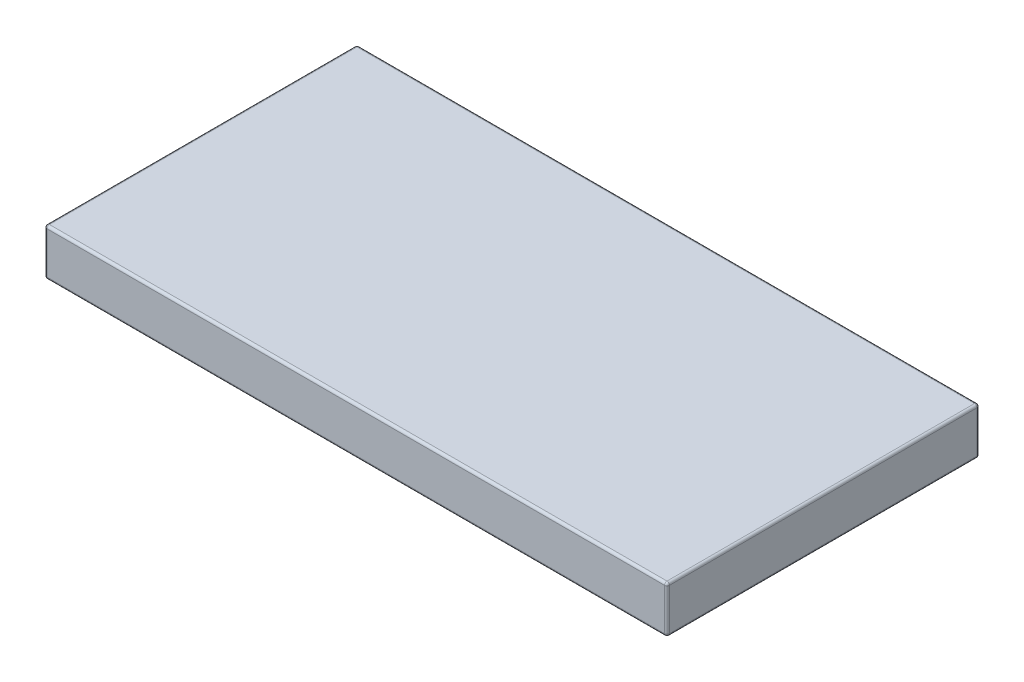
ISO-10303-21;
HEADER;
FILE_DESCRIPTION(('STEP AP214'),'2;1');
FILE_NAME('part.step','',(''),(''),'','','');
FILE_SCHEMA(('AUTOMOTIVE_DESIGN { 1 0 10303 214 1 1 1 1 }'));
ENDSEC;
DATA;
#1=APPLICATION_CONTEXT('core data for automotive mechanical design processes');
#2=APPLICATION_PROTOCOL_DEFINITION('international standard','automotive_design',2000,#1);
#3=PRODUCT_CONTEXT('',#1,'mechanical');
#4=PRODUCT('Part','Part','',(#3));
#5=PRODUCT_RELATED_PRODUCT_CATEGORY('part','',(#4));
#6=PRODUCT_DEFINITION_FORMATION('','',#4);
#7=PRODUCT_DEFINITION_CONTEXT('part definition',#1,'design');
#8=PRODUCT_DEFINITION('design','',#6,#7);
#9=PRODUCT_DEFINITION_SHAPE('','',#8);
#10=(LENGTH_UNIT() NAMED_UNIT(*) SI_UNIT(.MILLI.,.METRE.));
#11=(NAMED_UNIT(*) PLANE_ANGLE_UNIT() SI_UNIT($,.RADIAN.));
#12=(NAMED_UNIT(*) SI_UNIT($,.STERADIAN.) SOLID_ANGLE_UNIT());
#13=UNCERTAINTY_MEASURE_WITH_UNIT(LENGTH_MEASURE(1.E-05),#10,'distance_accuracy_value','');
#14=(GEOMETRIC_REPRESENTATION_CONTEXT(3) GLOBAL_UNCERTAINTY_ASSIGNED_CONTEXT((#13)) GLOBAL_UNIT_ASSIGNED_CONTEXT((#10,
#11,#12)) REPRESENTATION_CONTEXT('',''));
#15=CARTESIAN_POINT('',(0.,0.,0.));
#16=DIRECTION('',(0.,0.,1.));
#17=DIRECTION('',(1.,0.,0.));
#18=AXIS2_PLACEMENT_3D('',#15,#16,#17);
#19=CARTESIAN_POINT('',(-44.6911278195489,19.,-108.632180451128));
#20=DIRECTION('',(1.,0.,0.));
#21=DIRECTION('',(0.,0.,-1.));
#22=AXIS2_PLACEMENT_3D('',#19,#20,#21);
#23=PLANE('',#22);
#24=DIRECTION('',(0.,-1.,0.));
#25=VECTOR('',#24,1.);
#26=CARTESIAN_POINT('',(-44.6911278195489,19.,-107.632180451128));
#27=LINE('',#26,#25);
#28=CARTESIAN_POINT('',(-44.6911278195489,18.,-107.632180451128));
#29=VERTEX_POINT('',#28);
#30=CARTESIAN_POINT('',(-44.6911278195489,1.,-107.632180451128));
#31=VERTEX_POINT('',#30);
#32=EDGE_CURVE('E140',#29,#31,#27,.T.);
#33=ORIENTED_EDGE('',*,*,#32,.T.);
#34=DIRECTION('',(0.,0.,1.));
#35=VECTOR('',#34,1.);
#36=CARTESIAN_POINT('',(-44.6911278195489,1.,-108.632180451128));
#37=LINE('',#36,#35);
#38=CARTESIAN_POINT('',(-44.6911278195489,1.,17.3678195488722));
#39=VERTEX_POINT('',#38);
#40=EDGE_CURVE('E197',#31,#39,#37,.T.);
#41=ORIENTED_EDGE('',*,*,#40,.T.);
#42=DIRECTION('',(0.,-1.,0.));
#43=VECTOR('',#42,1.);
#44=CARTESIAN_POINT('',(-44.6911278195489,19.,17.3678195488722));
#45=LINE('',#44,#43);
#46=CARTESIAN_POINT('',(-44.6911278195489,18.,17.3678195488722));
#47=VERTEX_POINT('',#46);
#48=EDGE_CURVE('E194',#39,#47,#45,.F.);
#49=ORIENTED_EDGE('',*,*,#48,.T.);
#50=DIRECTION('',(0.,0.,1.));
#51=VECTOR('',#50,1.);
#52=CARTESIAN_POINT('',(-44.6911278195489,18.,-108.632180451128));
#53=LINE('',#52,#51);
#54=EDGE_CURVE('E192',#47,#29,#53,.F.);
#55=ORIENTED_EDGE('',*,*,#54,.T.);
#56=EDGE_LOOP('',(#33,#41,#49,#55));
#57=FACE_BOUND('',#56,.T.);
#58=ADVANCED_FACE('F33',(#57),#23,.F.);
#59=CARTESIAN_POINT('',(-44.6911278195489,19.,18.3678195488722));
#60=DIRECTION('',(0.,0.,-1.));
#61=DIRECTION('',(-1.,0.,0.));
#62=AXIS2_PLACEMENT_3D('',#59,#60,#61);
#63=PLANE('',#62);
#64=DIRECTION('',(1.,0.,0.));
#65=VECTOR('',#64,1.);
#66=CARTESIAN_POINT('',(-44.6911278195489,1.,18.3678195488722));
#67=LINE('',#66,#65);
#68=CARTESIAN_POINT('',(-43.6911278195489,1.,18.3678195488722));
#69=VERTEX_POINT('',#68);
#70=CARTESIAN_POINT('',(207.308872180451,1.,18.3678195488722));
#71=VERTEX_POINT('',#70);
#72=EDGE_CURVE('E187',#69,#71,#67,.T.);
#73=ORIENTED_EDGE('',*,*,#72,.T.);
#74=DIRECTION('',(0.,-1.,0.));
#75=VECTOR('',#74,1.);
#76=CARTESIAN_POINT('',(207.308872180451,19.,18.3678195488722));
#77=LINE('',#76,#75);
#78=CARTESIAN_POINT('',(207.308872180451,18.,18.3678195488722));
#79=VERTEX_POINT('',#78);
#80=EDGE_CURVE('E189',#71,#79,#77,.F.);
#81=ORIENTED_EDGE('',*,*,#80,.T.);
#82=DIRECTION('',(1.,0.,0.));
#83=VECTOR('',#82,1.);
#84=CARTESIAN_POINT('',(-44.6911278195489,18.,18.3678195488722));
#85=LINE('',#84,#83);
#86=CARTESIAN_POINT('',(-43.6911278195489,18.,18.3678195488722));
#87=VERTEX_POINT('',#86);
#88=EDGE_CURVE('E183',#79,#87,#85,.F.);
#89=ORIENTED_EDGE('',*,*,#88,.T.);
#90=DIRECTION('',(0.,-1.,0.));
#91=VECTOR('',#90,1.);
#92=CARTESIAN_POINT('',(-43.6911278195489,19.,18.3678195488722));
#93=LINE('',#92,#91);
#94=EDGE_CURVE('E185',#87,#69,#93,.T.);
#95=ORIENTED_EDGE('',*,*,#94,.T.);
#96=EDGE_LOOP('',(#73,#81,#89,#95));
#97=FACE_BOUND('',#96,.T.);
#98=ADVANCED_FACE('F275',(#97),#63,.F.);
#99=CARTESIAN_POINT('',(208.308872180451,19.,-108.632180451128));
#100=DIRECTION('',(-1.,0.,0.));
#101=DIRECTION('',(0.,0.,1.));
#102=AXIS2_PLACEMENT_3D('',#99,#100,#101);
#103=PLANE('',#102);
#104=DIRECTION('',(0.,0.,-1.));
#105=VECTOR('',#104,1.);
#106=CARTESIAN_POINT('',(208.308872180451,1.,-108.632180451128));
#107=LINE('',#106,#105);
#108=CARTESIAN_POINT('',(208.308872180451,1.,17.3678195488722));
#109=VERTEX_POINT('',#108);
#110=CARTESIAN_POINT('',(208.308872180451,1.,-107.632180451128));
#111=VERTEX_POINT('',#110);
#112=EDGE_CURVE('E169',#109,#111,#107,.T.);
#113=ORIENTED_EDGE('',*,*,#112,.T.);
#114=DIRECTION('',(0.,-1.,0.));
#115=VECTOR('',#114,1.);
#116=CARTESIAN_POINT('',(208.308872180451,19.,-107.632180451128));
#117=LINE('',#116,#115);
#118=CARTESIAN_POINT('',(208.308872180451,18.,-107.632180451128));
#119=VERTEX_POINT('',#118);
#120=EDGE_CURVE('E171',#111,#119,#117,.F.);
#121=ORIENTED_EDGE('',*,*,#120,.T.);
#122=DIRECTION('',(0.,0.,-1.));
#123=VECTOR('',#122,1.);
#124=CARTESIAN_POINT('',(208.308872180451,18.,18.3678195488722));
#125=LINE('',#124,#123);
#126=CARTESIAN_POINT('',(208.308872180451,18.,17.3678195488722));
#127=VERTEX_POINT('',#126);
#128=EDGE_CURVE('E165',#119,#127,#125,.F.);
#129=ORIENTED_EDGE('',*,*,#128,.T.);
#130=DIRECTION('',(0.,-1.,0.));
#131=VECTOR('',#130,1.);
#132=CARTESIAN_POINT('',(208.308872180451,19.,17.3678195488722));
#133=LINE('',#132,#131);
#134=EDGE_CURVE('E167',#127,#109,#133,.T.);
#135=ORIENTED_EDGE('',*,*,#134,.T.);
#136=EDGE_LOOP('',(#113,#121,#129,#135));
#137=FACE_BOUND('',#136,.T.);
#138=ADVANCED_FACE('F301',(#137),#103,.F.);
#139=CARTESIAN_POINT('',(-44.6911278195489,19.,-108.632180451128));
#140=DIRECTION('',(0.,0.,1.));
#141=DIRECTION('',(1.,0.,0.));
#142=AXIS2_PLACEMENT_3D('',#139,#140,#141);
#143=PLANE('',#142);
#144=DIRECTION('',(-1.,0.,0.));
#145=VECTOR('',#144,1.);
#146=CARTESIAN_POINT('',(208.308872180451,18.,-108.632180451128));
#147=LINE('',#146,#145);
#148=CARTESIAN_POINT('',(-43.6911278195489,18.,-108.632180451128));
#149=VERTEX_POINT('',#148);
#150=CARTESIAN_POINT('',(207.308872180451,18.,-108.632180451128));
#151=VERTEX_POINT('',#150);
#152=EDGE_CURVE('E126',#149,#151,#147,.F.);
#153=ORIENTED_EDGE('',*,*,#152,.T.);
#154=DIRECTION('',(0.,-1.,0.));
#155=VECTOR('',#154,1.);
#156=CARTESIAN_POINT('',(207.308872180451,19.,-108.632180451128));
#157=LINE('',#156,#155);
#158=CARTESIAN_POINT('',(207.308872180451,1.,-108.632180451128));
#159=VERTEX_POINT('',#158);
#160=EDGE_CURVE('E163',#151,#159,#157,.T.);
#161=ORIENTED_EDGE('',*,*,#160,.T.);
#162=DIRECTION('',(-1.,0.,0.));
#163=VECTOR('',#162,1.);
#164=CARTESIAN_POINT('',(-44.6911278195489,1.,-108.632180451128));
#165=LINE('',#164,#163);
#166=CARTESIAN_POINT('',(-43.6911278195489,1.,-108.632180451128));
#167=VERTEX_POINT('',#166);
#168=EDGE_CURVE('E129',#159,#167,#165,.T.);
#169=ORIENTED_EDGE('',*,*,#168,.T.);
#170=DIRECTION('',(0.,-1.,0.));
#171=VECTOR('',#170,1.);
#172=CARTESIAN_POINT('',(-43.6911278195489,19.,-108.632180451128));
#173=LINE('',#172,#171);
#174=EDGE_CURVE('E121',#167,#149,#173,.F.);
#175=ORIENTED_EDGE('',*,*,#174,.T.);
#176=EDGE_LOOP('',(#153,#161,#169,#175));
#177=FACE_BOUND('',#176,.T.);
#178=ADVANCED_FACE('F123',(#177),#143,.F.);
#179=CARTESIAN_POINT('',(0.,19.,0.));
#180=DIRECTION('',(0.,1.,0.));
#181=DIRECTION('',(0.,0.,1.));
#182=AXIS2_PLACEMENT_3D('',#179,#180,#181);
#183=PLANE('',#182);
#184=DIRECTION('',(0.,0.,-1.));
#185=VECTOR('',#184,1.);
#186=CARTESIAN_POINT('',(207.308872180451,19.,-108.632180451128));
#187=LINE('',#186,#185);
#188=CARTESIAN_POINT('',(207.308872180451,19.,17.3678195488722));
#189=VERTEX_POINT('',#188);
#190=CARTESIAN_POINT('',(207.308872180451,19.,-107.632180451128));
#191=VERTEX_POINT('',#190);
#192=EDGE_CURVE('E42',#189,#191,#187,.T.);
#193=ORIENTED_EDGE('',*,*,#192,.T.);
#194=DIRECTION('',(-1.,0.,0.));
#195=VECTOR('',#194,1.);
#196=CARTESIAN_POINT('',(-44.6911278195489,19.,-107.632180451128));
#197=LINE('',#196,#195);
#198=CARTESIAN_POINT('',(-43.6911278195489,19.,-107.632180451128));
#199=VERTEX_POINT('',#198);
#200=EDGE_CURVE('E11',#191,#199,#197,.T.);
#201=ORIENTED_EDGE('',*,*,#200,.T.);
#202=DIRECTION('',(0.,0.,1.));
#203=VECTOR('',#202,1.);
#204=CARTESIAN_POINT('',(-43.6911278195489,19.,18.3678195488722));
#205=LINE('',#204,#203);
#206=CARTESIAN_POINT('',(-43.6911278195489,19.,17.3678195488722));
#207=VERTEX_POINT('',#206);
#208=EDGE_CURVE('E199',#199,#207,#205,.T.);
#209=ORIENTED_EDGE('',*,*,#208,.T.);
#210=DIRECTION('',(1.,0.,0.));
#211=VECTOR('',#210,1.);
#212=CARTESIAN_POINT('',(208.308872180451,19.,17.3678195488722));
#213=LINE('',#212,#211);
#214=EDGE_CURVE('E53',#207,#189,#213,.T.);
#215=ORIENTED_EDGE('',*,*,#214,.T.);
#216=EDGE_LOOP('',(#193,#201,#209,#215));
#217=FACE_BOUND('',#216,.T.);
#218=ADVANCED_FACE('F364',(#217),#183,.T.);
#219=CARTESIAN_POINT('',(0.,0.,0.));
#220=DIRECTION('',(0.,1.,0.));
#221=DIRECTION('',(0.,0.,1.));
#222=AXIS2_PLACEMENT_3D('',#219,#220,#221);
#223=PLANE('',#222);
#224=DIRECTION('',(-1.,0.,0.));
#225=VECTOR('',#224,1.);
#226=CARTESIAN_POINT('',(0.,0.,-107.632180451128));
#227=LINE('',#226,#225);
#228=CARTESIAN_POINT('',(-43.6911278195489,0.,-107.632180451128));
#229=VERTEX_POINT('',#228);
#230=CARTESIAN_POINT('',(207.308872180451,0.,-107.632180451128));
#231=VERTEX_POINT('',#230);
#232=EDGE_CURVE('E178',#229,#231,#227,.F.);
#233=ORIENTED_EDGE('',*,*,#232,.T.);
#234=DIRECTION('',(0.,0.,-1.));
#235=VECTOR('',#234,1.);
#236=CARTESIAN_POINT('',(207.308872180451,0.,0.));
#237=LINE('',#236,#235);
#238=CARTESIAN_POINT('',(207.308872180451,0.,17.3678195488722));
#239=VERTEX_POINT('',#238);
#240=EDGE_CURVE('E180',#231,#239,#237,.F.);
#241=ORIENTED_EDGE('',*,*,#240,.T.);
#242=DIRECTION('',(1.,0.,0.));
#243=VECTOR('',#242,1.);
#244=CARTESIAN_POINT('',(0.,0.,17.3678195488722));
#245=LINE('',#244,#243);
#246=CARTESIAN_POINT('',(-43.6911278195489,0.,17.3678195488722));
#247=VERTEX_POINT('',#246);
#248=EDGE_CURVE('E176',#239,#247,#245,.F.);
#249=ORIENTED_EDGE('',*,*,#248,.T.);
#250=DIRECTION('',(0.,0.,1.));
#251=VECTOR('',#250,1.);
#252=CARTESIAN_POINT('',(-43.6911278195489,0.,0.));
#253=LINE('',#252,#251);
#254=EDGE_CURVE('E174',#247,#229,#253,.F.);
#255=ORIENTED_EDGE('',*,*,#254,.T.);
#256=EDGE_LOOP('',(#233,#241,#249,#255));
#257=FACE_BOUND('',#256,.T.);
#258=ADVANCED_FACE('F266',(#257),#223,.F.);
#259=CARTESIAN_POINT('',(-43.6911278195489,19.,17.3678195488722));
#260=DIRECTION('',(0.,-1.,0.));
#261=DIRECTION('',(0.,0.,-1.));
#262=AXIS2_PLACEMENT_3D('',#259,#260,#261);
#263=CYLINDRICAL_SURFACE('',#262,1.);
#264=CARTESIAN_POINT('',(-43.6911278195489,18.,17.3678195488722));
#265=DIRECTION('',(0.,1.,0.));
#266=DIRECTION('',(0.,0.,1.));
#267=AXIS2_PLACEMENT_3D('',#264,#265,#266);
#268=CIRCLE('',#267,1.);
#269=EDGE_CURVE('E37',#47,#87,#268,.T.);
#270=ORIENTED_EDGE('',*,*,#269,.F.);
#271=ORIENTED_EDGE('',*,*,#48,.F.);
#272=CARTESIAN_POINT('',(-43.6911278195489,1.,17.3678195488722));
#273=DIRECTION('',(0.,-1.,0.));
#274=DIRECTION('',(0.,0.,-1.));
#275=AXIS2_PLACEMENT_3D('',#272,#273,#274);
#276=CIRCLE('',#275,1.);
#277=EDGE_CURVE('E160',#69,#39,#276,.T.);
#278=ORIENTED_EDGE('',*,*,#277,.F.);
#279=ORIENTED_EDGE('',*,*,#94,.F.);
#280=EDGE_LOOP('',(#270,#271,#278,#279));
#281=FACE_BOUND('',#280,.T.);
#282=ADVANCED_FACE('F35',(#281),#263,.T.);
#283=CARTESIAN_POINT('',(-43.6911278195489,18.,17.3678195488722));
#284=DIRECTION('',(0.,0.,1.));
#285=DIRECTION('',(1.,0.,0.));
#286=AXIS2_PLACEMENT_3D('',#283,#284,#285);
#287=SPHERICAL_SURFACE('',#286,1.);
#288=CARTESIAN_POINT('',(-43.6911278195489,18.,17.3678195488722));
#289=DIRECTION('',(0.,0.,1.));
#290=DIRECTION('',(1.,0.,0.));
#291=AXIS2_PLACEMENT_3D('',#288,#289,#290);
#292=CIRCLE('',#291,1.);
#293=EDGE_CURVE('E244',#47,#207,#292,.F.);
#294=ORIENTED_EDGE('',*,*,#293,.F.);
#295=ORIENTED_EDGE('',*,*,#269,.T.);
#296=CARTESIAN_POINT('',(-43.6911278195489,18.,17.3678195488722));
#297=DIRECTION('',(-1.,0.,0.));
#298=DIRECTION('',(0.,0.,1.));
#299=AXIS2_PLACEMENT_3D('',#296,#297,#298);
#300=CIRCLE('',#299,1.);
#301=EDGE_CURVE('E247',#207,#87,#300,.F.);
#302=ORIENTED_EDGE('',*,*,#301,.F.);
#303=EDGE_LOOP('',(#294,#295,#302));
#304=FACE_BOUND('',#303,.T.);
#305=ADVANCED_FACE('F291',(#304),#287,.T.);
#306=CARTESIAN_POINT('',(-43.6911278195489,1.,17.3678195488722));
#307=DIRECTION('',(0.,0.,1.));
#308=DIRECTION('',(1.,0.,0.));
#309=AXIS2_PLACEMENT_3D('',#306,#307,#308);
#310=SPHERICAL_SURFACE('',#309,1.);
#311=CARTESIAN_POINT('',(-43.6911278195489,1.,17.3678195488722));
#312=DIRECTION('',(-1.,0.,0.));
#313=DIRECTION('',(0.,0.,1.));
#314=AXIS2_PLACEMENT_3D('',#311,#312,#313);
#315=CIRCLE('',#314,1.);
#316=EDGE_CURVE('E238',#69,#247,#315,.F.);
#317=ORIENTED_EDGE('',*,*,#316,.F.);
#318=ORIENTED_EDGE('',*,*,#277,.T.);
#319=CARTESIAN_POINT('',(-43.6911278195489,1.,17.3678195488722));
#320=DIRECTION('',(0.,0.,1.));
#321=DIRECTION('',(1.,0.,0.));
#322=AXIS2_PLACEMENT_3D('',#319,#320,#321);
#323=CIRCLE('',#322,1.);
#324=EDGE_CURVE('E241',#247,#39,#323,.F.);
#325=ORIENTED_EDGE('',*,*,#324,.F.);
#326=EDGE_LOOP('',(#317,#318,#325));
#327=FACE_BOUND('',#326,.T.);
#328=ADVANCED_FACE('F254',(#327),#310,.T.);
#329=CARTESIAN_POINT('',(0.,18.,17.3678195488722));
#330=DIRECTION('',(-1.,0.,0.));
#331=DIRECTION('',(0.,0.,1.));
#332=AXIS2_PLACEMENT_3D('',#329,#330,#331);
#333=CYLINDRICAL_SURFACE('',#332,1.);
#334=ORIENTED_EDGE('',*,*,#301,.T.);
#335=ORIENTED_EDGE('',*,*,#88,.F.);
#336=CARTESIAN_POINT('',(207.308872180451,18.,17.3678195488722));
#337=DIRECTION('',(1.,0.,0.));
#338=DIRECTION('',(0.,0.,-1.));
#339=AXIS2_PLACEMENT_3D('',#336,#337,#338);
#340=CIRCLE('',#339,1.);
#341=EDGE_CURVE('E233',#189,#79,#340,.T.);
#342=ORIENTED_EDGE('',*,*,#341,.F.);
#343=ORIENTED_EDGE('',*,*,#214,.F.);
#344=EDGE_LOOP('',(#334,#335,#342,#343));
#345=FACE_BOUND('',#344,.T.);
#346=ADVANCED_FACE('F286',(#345),#333,.T.);
#347=CARTESIAN_POINT('',(-43.6911278195489,18.,0.));
#348=DIRECTION('',(0.,0.,-1.));
#349=DIRECTION('',(-1.,0.,0.));
#350=AXIS2_PLACEMENT_3D('',#347,#348,#349);
#351=CYLINDRICAL_SURFACE('',#350,1.);
#352=ORIENTED_EDGE('',*,*,#293,.T.);
#353=ORIENTED_EDGE('',*,*,#208,.F.);
#354=CARTESIAN_POINT('',(-43.6911278195489,18.,-107.632180451128));
#355=DIRECTION('',(0.,0.,-1.));
#356=DIRECTION('',(-1.,0.,0.));
#357=AXIS2_PLACEMENT_3D('',#354,#355,#356);
#358=CIRCLE('',#357,1.);
#359=EDGE_CURVE('E144',#29,#199,#358,.T.);
#360=ORIENTED_EDGE('',*,*,#359,.F.);
#361=ORIENTED_EDGE('',*,*,#54,.F.);
#362=EDGE_LOOP('',(#352,#353,#360,#361));
#363=FACE_BOUND('',#362,.T.);
#364=ADVANCED_FACE('F294',(#363),#351,.T.);
#365=CARTESIAN_POINT('',(-43.6911278195489,19.,-107.632180451128));
#366=DIRECTION('',(0.,-1.,0.));
#367=DIRECTION('',(0.,0.,-1.));
#368=AXIS2_PLACEMENT_3D('',#365,#366,#367);
#369=CYLINDRICAL_SURFACE('',#368,1.);
#370=CARTESIAN_POINT('',(-43.6911278195489,1.,-107.632180451128));
#371=DIRECTION('',(0.,-1.,0.));
#372=DIRECTION('',(0.,0.,-1.));
#373=AXIS2_PLACEMENT_3D('',#370,#371,#372);
#374=CIRCLE('',#373,1.);
#375=EDGE_CURVE('E145',#31,#167,#374,.T.);
#376=ORIENTED_EDGE('',*,*,#375,.F.);
#377=ORIENTED_EDGE('',*,*,#32,.F.);
#378=CARTESIAN_POINT('',(-43.6911278195489,18.,-107.632180451128));
#379=DIRECTION('',(0.,1.,0.));
#380=DIRECTION('',(0.,0.,1.));
#381=AXIS2_PLACEMENT_3D('',#378,#379,#380);
#382=CIRCLE('',#381,1.);
#383=EDGE_CURVE('E136',#149,#29,#382,.T.);
#384=ORIENTED_EDGE('',*,*,#383,.F.);
#385=ORIENTED_EDGE('',*,*,#174,.F.);
#386=EDGE_LOOP('',(#376,#377,#384,#385));
#387=FACE_BOUND('',#386,.T.);
#388=ADVANCED_FACE('F138',(#387),#369,.T.);
#389=CARTESIAN_POINT('',(-43.6911278195489,1.,-108.632180451128));
#390=DIRECTION('',(0.,0.,1.));
#391=DIRECTION('',(1.,0.,0.));
#392=AXIS2_PLACEMENT_3D('',#389,#390,#391);
#393=CYLINDRICAL_SURFACE('',#392,1.);
#394=ORIENTED_EDGE('',*,*,#324,.T.);
#395=ORIENTED_EDGE('',*,*,#40,.F.);
#396=CARTESIAN_POINT('',(-43.6911278195489,1.,-107.632180451128));
#397=DIRECTION('',(0.,0.,-1.));
#398=DIRECTION('',(-1.,0.,0.));
#399=AXIS2_PLACEMENT_3D('',#396,#397,#398);
#400=CIRCLE('',#399,1.);
#401=EDGE_CURVE('E229',#229,#31,#400,.T.);
#402=ORIENTED_EDGE('',*,*,#401,.F.);
#403=ORIENTED_EDGE('',*,*,#254,.F.);
#404=EDGE_LOOP('',(#394,#395,#402,#403));
#405=FACE_BOUND('',#404,.T.);
#406=ADVANCED_FACE('F262',(#405),#393,.T.);
#407=CARTESIAN_POINT('',(-44.6911278195489,1.,17.3678195488722));
#408=DIRECTION('',(1.,0.,0.));
#409=DIRECTION('',(0.,0.,-1.));
#410=AXIS2_PLACEMENT_3D('',#407,#408,#409);
#411=CYLINDRICAL_SURFACE('',#410,1.);
#412=ORIENTED_EDGE('',*,*,#316,.T.);
#413=ORIENTED_EDGE('',*,*,#248,.F.);
#414=CARTESIAN_POINT('',(207.308872180451,1.,17.3678195488722));
#415=DIRECTION('',(1.,0.,0.));
#416=DIRECTION('',(0.,0.,-1.));
#417=AXIS2_PLACEMENT_3D('',#414,#415,#416);
#418=CIRCLE('',#417,1.);
#419=EDGE_CURVE('E226',#71,#239,#418,.T.);
#420=ORIENTED_EDGE('',*,*,#419,.F.);
#421=ORIENTED_EDGE('',*,*,#72,.F.);
#422=EDGE_LOOP('',(#412,#413,#420,#421));
#423=FACE_BOUND('',#422,.T.);
#424=ADVANCED_FACE('F272',(#423),#411,.T.);
#425=CARTESIAN_POINT('',(207.308872180451,19.,17.3678195488722));
#426=DIRECTION('',(0.,-1.,0.));
#427=DIRECTION('',(0.,0.,-1.));
#428=AXIS2_PLACEMENT_3D('',#425,#426,#427);
#429=CYLINDRICAL_SURFACE('',#428,1.);
#430=CARTESIAN_POINT('',(207.308872180451,18.,17.3678195488722));
#431=DIRECTION('',(0.,1.,0.));
#432=DIRECTION('',(0.,0.,1.));
#433=AXIS2_PLACEMENT_3D('',#430,#431,#432);
#434=CIRCLE('',#433,1.);
#435=EDGE_CURVE('E235',#79,#127,#434,.T.);
#436=ORIENTED_EDGE('',*,*,#435,.F.);
#437=ORIENTED_EDGE('',*,*,#80,.F.);
#438=CARTESIAN_POINT('',(207.308872180451,1.,17.3678195488722));
#439=DIRECTION('',(0.,-1.,0.));
#440=DIRECTION('',(0.,0.,-1.));
#441=AXIS2_PLACEMENT_3D('',#438,#439,#440);
#442=CIRCLE('',#441,1.);
#443=EDGE_CURVE('E223',#109,#71,#442,.T.);
#444=ORIENTED_EDGE('',*,*,#443,.F.);
#445=ORIENTED_EDGE('',*,*,#134,.F.);
#446=EDGE_LOOP('',(#436,#437,#444,#445));
#447=FACE_BOUND('',#446,.T.);
#448=ADVANCED_FACE('F279',(#447),#429,.T.);
#449=CARTESIAN_POINT('',(207.308872180451,18.,17.3678195488722));
#450=DIRECTION('',(0.,0.,1.));
#451=DIRECTION('',(1.,0.,0.));
#452=AXIS2_PLACEMENT_3D('',#449,#450,#451);
#453=SPHERICAL_SURFACE('',#452,1.);
#454=ORIENTED_EDGE('',*,*,#341,.T.);
#455=ORIENTED_EDGE('',*,*,#435,.T.);
#456=CARTESIAN_POINT('',(207.308872180451,18.,17.3678195488722));
#457=DIRECTION('',(0.,0.,1.));
#458=DIRECTION('',(0.,-1.,0.));
#459=AXIS2_PLACEMENT_3D('',#456,#457,#458);
#460=CIRCLE('',#459,1.);
#461=EDGE_CURVE('E151',#189,#127,#460,.F.);
#462=ORIENTED_EDGE('',*,*,#461,.F.);
#463=EDGE_LOOP('',(#454,#455,#462));
#464=FACE_BOUND('',#463,.T.);
#465=ADVANCED_FACE('F341',(#464),#453,.T.);
#466=CARTESIAN_POINT('',(-43.6911278195489,18.,-107.632180451128));
#467=DIRECTION('',(0.,0.,1.));
#468=DIRECTION('',(1.,0.,0.));
#469=AXIS2_PLACEMENT_3D('',#466,#467,#468);
#470=SPHERICAL_SURFACE('',#469,1.);
#471=ORIENTED_EDGE('',*,*,#383,.T.);
#472=ORIENTED_EDGE('',*,*,#359,.T.);
#473=CARTESIAN_POINT('',(-43.6911278195489,18.,-107.632180451128));
#474=DIRECTION('',(-1.,0.,0.));
#475=DIRECTION('',(0.,0.,1.));
#476=AXIS2_PLACEMENT_3D('',#473,#474,#475);
#477=CIRCLE('',#476,1.);
#478=EDGE_CURVE('E147',#149,#199,#477,.F.);
#479=ORIENTED_EDGE('',*,*,#478,.F.);
#480=EDGE_LOOP('',(#471,#472,#479));
#481=FACE_BOUND('',#480,.T.);
#482=ADVANCED_FACE('F148',(#481),#470,.T.);
#483=CARTESIAN_POINT('',(-43.6911278195489,1.,-107.632180451128));
#484=DIRECTION('',(0.,0.,1.));
#485=DIRECTION('',(1.,0.,0.));
#486=AXIS2_PLACEMENT_3D('',#483,#484,#485);
#487=SPHERICAL_SURFACE('',#486,1.);
#488=ORIENTED_EDGE('',*,*,#401,.T.);
#489=ORIENTED_EDGE('',*,*,#375,.T.);
#490=CARTESIAN_POINT('',(-43.6911278195489,1.,-107.632180451128));
#491=DIRECTION('',(-1.,0.,0.));
#492=DIRECTION('',(0.,0.,1.));
#493=AXIS2_PLACEMENT_3D('',#490,#491,#492);
#494=CIRCLE('',#493,1.);
#495=EDGE_CURVE('E152',#229,#167,#494,.F.);
#496=ORIENTED_EDGE('',*,*,#495,.F.);
#497=EDGE_LOOP('',(#488,#489,#496));
#498=FACE_BOUND('',#497,.T.);
#499=ADVANCED_FACE('F334',(#498),#487,.T.);
#500=CARTESIAN_POINT('',(207.308872180451,1.,17.3678195488722));
#501=DIRECTION('',(0.,0.,1.));
#502=DIRECTION('',(1.,0.,0.));
#503=AXIS2_PLACEMENT_3D('',#500,#501,#502);
#504=SPHERICAL_SURFACE('',#503,1.);
#505=ORIENTED_EDGE('',*,*,#443,.T.);
#506=ORIENTED_EDGE('',*,*,#419,.T.);
#507=CARTESIAN_POINT('',(207.308872180451,1.,17.3678195488722));
#508=DIRECTION('',(0.,0.,1.));
#509=DIRECTION('',(1.,0.,0.));
#510=AXIS2_PLACEMENT_3D('',#507,#508,#509);
#511=CIRCLE('',#510,1.);
#512=EDGE_CURVE('E217',#109,#239,#511,.F.);
#513=ORIENTED_EDGE('',*,*,#512,.F.);
#514=EDGE_LOOP('',(#505,#506,#513));
#515=FACE_BOUND('',#514,.T.);
#516=ADVANCED_FACE('F330',(#515),#504,.T.);
#517=CARTESIAN_POINT('',(207.308872180451,18.,0.));
#518=DIRECTION('',(0.,0.,1.));
#519=DIRECTION('',(1.,0.,0.));
#520=AXIS2_PLACEMENT_3D('',#517,#518,#519);
#521=CYLINDRICAL_SURFACE('',#520,1.);
#522=ORIENTED_EDGE('',*,*,#461,.T.);
#523=ORIENTED_EDGE('',*,*,#128,.F.);
#524=CARTESIAN_POINT('',(207.308872180451,18.,-107.632180451128));
#525=DIRECTION('',(0.,0.,-1.));
#526=DIRECTION('',(-1.,0.,0.));
#527=AXIS2_PLACEMENT_3D('',#524,#525,#526);
#528=CIRCLE('',#527,1.);
#529=EDGE_CURVE('E214',#191,#119,#528,.T.);
#530=ORIENTED_EDGE('',*,*,#529,.F.);
#531=ORIENTED_EDGE('',*,*,#192,.F.);
#532=EDGE_LOOP('',(#522,#523,#530,#531));
#533=FACE_BOUND('',#532,.T.);
#534=ADVANCED_FACE('F327',(#533),#521,.T.);
#535=CARTESIAN_POINT('',(0.,18.,-107.632180451128));
#536=DIRECTION('',(1.,0.,0.));
#537=DIRECTION('',(0.,0.,-1.));
#538=AXIS2_PLACEMENT_3D('',#535,#536,#537);
#539=CYLINDRICAL_SURFACE('',#538,1.);
#540=ORIENTED_EDGE('',*,*,#478,.T.);
#541=ORIENTED_EDGE('',*,*,#200,.F.);
#542=CARTESIAN_POINT('',(207.308872180451,18.,-107.632180451128));
#543=DIRECTION('',(1.,0.,0.));
#544=DIRECTION('',(0.,0.,-1.));
#545=AXIS2_PLACEMENT_3D('',#542,#543,#544);
#546=CIRCLE('',#545,1.);
#547=EDGE_CURVE('E156',#151,#191,#546,.T.);
#548=ORIENTED_EDGE('',*,*,#547,.F.);
#549=ORIENTED_EDGE('',*,*,#152,.F.);
#550=EDGE_LOOP('',(#540,#541,#548,#549));
#551=FACE_BOUND('',#550,.T.);
#552=ADVANCED_FACE('F154',(#551),#539,.T.);
#553=CARTESIAN_POINT('',(-44.6911278195489,1.,-107.632180451128));
#554=DIRECTION('',(-1.,0.,0.));
#555=DIRECTION('',(0.,0.,1.));
#556=AXIS2_PLACEMENT_3D('',#553,#554,#555);
#557=CYLINDRICAL_SURFACE('',#556,1.);
#558=ORIENTED_EDGE('',*,*,#495,.T.);
#559=ORIENTED_EDGE('',*,*,#168,.F.);
#560=CARTESIAN_POINT('',(207.308872180451,1.,-107.632180451128));
#561=DIRECTION('',(1.,0.,0.));
#562=DIRECTION('',(0.,0.,-1.));
#563=AXIS2_PLACEMENT_3D('',#560,#561,#562);
#564=CIRCLE('',#563,1.);
#565=EDGE_CURVE('E210',#231,#159,#564,.T.);
#566=ORIENTED_EDGE('',*,*,#565,.F.);
#567=ORIENTED_EDGE('',*,*,#232,.F.);
#568=EDGE_LOOP('',(#558,#559,#566,#567));
#569=FACE_BOUND('',#568,.T.);
#570=ADVANCED_FACE('F320',(#569),#557,.T.);
#571=CARTESIAN_POINT('',(207.308872180451,1.,-108.632180451128));
#572=DIRECTION('',(0.,0.,-1.));
#573=DIRECTION('',(-1.,0.,0.));
#574=AXIS2_PLACEMENT_3D('',#571,#572,#573);
#575=CYLINDRICAL_SURFACE('',#574,1.);
#576=ORIENTED_EDGE('',*,*,#512,.T.);
#577=ORIENTED_EDGE('',*,*,#240,.F.);
#578=CARTESIAN_POINT('',(207.308872180451,1.,-107.632180451128));
#579=DIRECTION('',(0.,0.,-1.));
#580=DIRECTION('',(-1.,0.,0.));
#581=AXIS2_PLACEMENT_3D('',#578,#579,#580);
#582=CIRCLE('',#581,1.);
#583=EDGE_CURVE('E207',#111,#231,#582,.T.);
#584=ORIENTED_EDGE('',*,*,#583,.F.);
#585=ORIENTED_EDGE('',*,*,#112,.F.);
#586=EDGE_LOOP('',(#576,#577,#584,#585));
#587=FACE_BOUND('',#586,.T.);
#588=ADVANCED_FACE('F316',(#587),#575,.T.);
#589=CARTESIAN_POINT('',(207.308872180451,18.,-107.632180451128));
#590=DIRECTION('',(0.,0.,1.));
#591=DIRECTION('',(1.,0.,0.));
#592=AXIS2_PLACEMENT_3D('',#589,#590,#591);
#593=SPHERICAL_SURFACE('',#592,1.);
#594=ORIENTED_EDGE('',*,*,#547,.T.);
#595=ORIENTED_EDGE('',*,*,#529,.T.);
#596=CARTESIAN_POINT('',(207.308872180451,18.,-107.632180451128));
#597=DIRECTION('',(0.,1.,0.));
#598=DIRECTION('',(0.,0.,1.));
#599=AXIS2_PLACEMENT_3D('',#596,#597,#598);
#600=CIRCLE('',#599,1.);
#601=EDGE_CURVE('E205',#151,#119,#600,.F.);
#602=ORIENTED_EDGE('',*,*,#601,.F.);
#603=EDGE_LOOP('',(#594,#595,#602));
#604=FACE_BOUND('',#603,.T.);
#605=ADVANCED_FACE('F312',(#604),#593,.T.);
#606=CARTESIAN_POINT('',(207.308872180451,1.,-107.632180451128));
#607=DIRECTION('',(0.,0.,1.));
#608=DIRECTION('',(1.,0.,0.));
#609=AXIS2_PLACEMENT_3D('',#606,#607,#608);
#610=SPHERICAL_SURFACE('',#609,1.);
#611=ORIENTED_EDGE('',*,*,#583,.T.);
#612=ORIENTED_EDGE('',*,*,#565,.T.);
#613=CARTESIAN_POINT('',(207.308872180451,1.,-107.632180451128));
#614=DIRECTION('',(0.,-1.,0.));
#615=DIRECTION('',(0.,0.,-1.));
#616=AXIS2_PLACEMENT_3D('',#613,#614,#615);
#617=CIRCLE('',#616,1.);
#618=EDGE_CURVE('E203',#111,#159,#617,.F.);
#619=ORIENTED_EDGE('',*,*,#618,.F.);
#620=EDGE_LOOP('',(#611,#612,#619));
#621=FACE_BOUND('',#620,.T.);
#622=ADVANCED_FACE('F308',(#621),#610,.T.);
#623=CARTESIAN_POINT('',(207.308872180451,19.,-107.632180451128));
#624=DIRECTION('',(0.,-1.,0.));
#625=DIRECTION('',(0.,0.,-1.));
#626=AXIS2_PLACEMENT_3D('',#623,#624,#625);
#627=CYLINDRICAL_SURFACE('',#626,1.);
#628=ORIENTED_EDGE('',*,*,#601,.T.);
#629=ORIENTED_EDGE('',*,*,#120,.F.);
#630=ORIENTED_EDGE('',*,*,#618,.T.);
#631=ORIENTED_EDGE('',*,*,#160,.F.);
#632=EDGE_LOOP('',(#628,#629,#630,#631));
#633=FACE_BOUND('',#632,.T.);
#634=ADVANCED_FACE('F305',(#633),#627,.T.);
#635=CLOSED_SHELL('',(#58,#98,#138,#178,#218,#258,#282,#305,#328,#346,#364,#388,#406,#424,#448,
#465,#482,#499,#516,#534,#552,#570,#588,#605,#622,#634));
#636=MANIFOLD_SOLID_BREP('B2',#635);
#637=ADVANCED_BREP_SHAPE_REPRESENTATION('',(#18,#636),#14);
#638=SHAPE_DEFINITION_REPRESENTATION(#9,#637);
ENDSEC;
END-ISO-10303-21;
